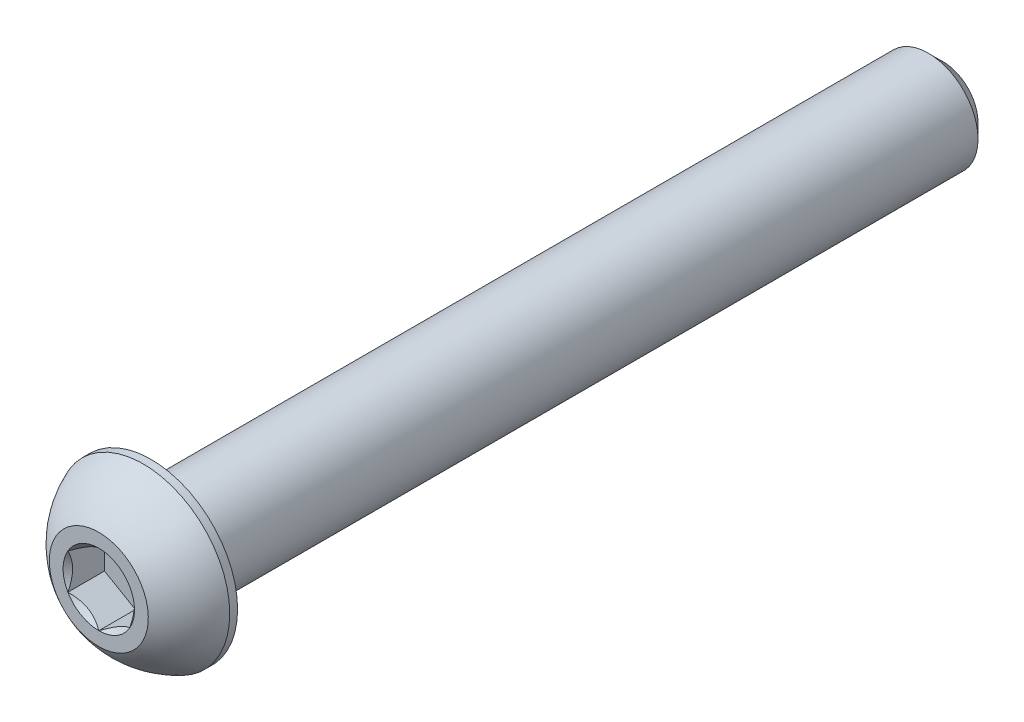
ISO-10303-21;
HEADER;
FILE_DESCRIPTION(('STEP AP214'),'2;1');
FILE_NAME('part.step','',(''),(''),'','','');
FILE_SCHEMA(('AUTOMOTIVE_DESIGN { 1 0 10303 214 1 1 1 1 }'));
ENDSEC;
DATA;
#1=APPLICATION_CONTEXT('core data for automotive mechanical design processes');
#2=APPLICATION_PROTOCOL_DEFINITION('international standard','automotive_design',2000,#1);
#3=PRODUCT_CONTEXT('',#1,'mechanical');
#4=PRODUCT('Part','Part','',(#3));
#5=PRODUCT_RELATED_PRODUCT_CATEGORY('part','',(#4));
#6=PRODUCT_DEFINITION_FORMATION('','',#4);
#7=PRODUCT_DEFINITION_CONTEXT('part definition',#1,'design');
#8=PRODUCT_DEFINITION('design','',#6,#7);
#9=PRODUCT_DEFINITION_SHAPE('','',#8);
#10=(LENGTH_UNIT() NAMED_UNIT(*) SI_UNIT(.MILLI.,.METRE.));
#11=(NAMED_UNIT(*) PLANE_ANGLE_UNIT() SI_UNIT($,.RADIAN.));
#12=(NAMED_UNIT(*) SI_UNIT($,.STERADIAN.) SOLID_ANGLE_UNIT());
#13=UNCERTAINTY_MEASURE_WITH_UNIT(LENGTH_MEASURE(1.E-05),#10,'distance_accuracy_value','');
#14=(GEOMETRIC_REPRESENTATION_CONTEXT(3) GLOBAL_UNCERTAINTY_ASSIGNED_CONTEXT((#13)) GLOBAL_UNIT_ASSIGNED_CONTEXT((#10,
#11,#12)) REPRESENTATION_CONTEXT('',''));
#15=CARTESIAN_POINT('',(0.,0.,0.));
#16=DIRECTION('',(0.,0.,1.));
#17=DIRECTION('',(1.,0.,0.));
#18=AXIS2_PLACEMENT_3D('',#15,#16,#17);
#19=CARTESIAN_POINT('',(0.,-3.175,-54.1528));
#20=DIRECTION('',(0.,0.,-1.));
#21=DIRECTION('',(0.,1.,0.));
#22=AXIS2_PLACEMENT_3D('',#19,#20,#21);
#23=PLANE('',#22);
#24=CARTESIAN_POINT('',(0.,0.,-54.1528));
#25=DIRECTION('',(0.,0.,-1.));
#26=DIRECTION('',(0.,1.,0.));
#27=AXIS2_PLACEMENT_3D('',#24,#25,#26);
#28=CIRCLE('',#27,2.24573170731707);
#29=CARTESIAN_POINT('',(0.,-2.24573170731706,-54.1528));
#30=VERTEX_POINT('',#29);
#31=EDGE_CURVE('E175',#30,#30,#28,.T.);
#32=ORIENTED_EDGE('',*,*,#31,.T.);
#33=EDGE_LOOP('',(#32));
#34=FACE_BOUND('',#33,.T.);
#35=ADVANCED_FACE('F36',(#34),#23,.T.);
#36=CARTESIAN_POINT('',(0.,0.,-54.1528));
#37=DIRECTION('',(0.,0.,-1.));
#38=DIRECTION('',(0.,1.,0.));
#39=AXIS2_PLACEMENT_3D('',#36,#37,#38);
#40=CYLINDRICAL_SURFACE('',#39,3.175);
#41=CARTESIAN_POINT('',(0.,0.,-53.2235317073171));
#42=DIRECTION('',(0.,0.,-1.));
#43=DIRECTION('',(0.,1.,0.));
#44=AXIS2_PLACEMENT_3D('',#41,#42,#43);
#45=CIRCLE('',#44,3.175);
#46=CARTESIAN_POINT('',(0.,-3.17499999999999,-53.2235317073171));
#47=VERTEX_POINT('',#46);
#48=EDGE_CURVE('E49',#47,#47,#45,.F.);
#49=ORIENTED_EDGE('',*,*,#48,.T.);
#50=EDGE_LOOP('',(#49));
#51=FACE_BOUND('',#50,.T.);
#52=CARTESIAN_POINT('',(0.,0.,-3.3528));
#53=DIRECTION('',(0.,0.,1.));
#54=DIRECTION('',(1.,0.,0.));
#55=AXIS2_PLACEMENT_3D('',#52,#53,#54);
#56=CIRCLE('',#55,3.175);
#57=CARTESIAN_POINT('',(3.175,0.,-3.3528));
#58=VERTEX_POINT('',#57);
#59=EDGE_CURVE('E172',#58,#58,#56,.F.);
#60=ORIENTED_EDGE('',*,*,#59,.T.);
#61=EDGE_LOOP('',(#60));
#62=FACE_BOUND('',#61,.T.);
#63=ADVANCED_FACE('F180',(#51,#62),#40,.T.);
#64=CARTESIAN_POINT('',(0.,0.,-54.1528));
#65=DIRECTION('',(0.,0.,1.));
#66=DIRECTION('',(0.,-1.,0.));
#67=AXIS2_PLACEMENT_3D('',#64,#65,#66);
#68=CONICAL_SURFACE('',#67,2.24573170731707,0.785398163397446);
#69=CARTESIAN_POINT('',(0.,-3.17499999999999,-53.2235317073171));
#70=CARTESIAN_POINT('',(0.,-3.16532012195122,-53.2332115853659));
#71=CARTESIAN_POINT('',(0.,-3.15564024390244,-53.2428914634146));
#72=CARTESIAN_POINT('',(0.,-3.13628048780487,-53.2622512195122));
#73=CARTESIAN_POINT('',(0.,-3.12660060975609,-53.271931097561));
#74=CARTESIAN_POINT('',(0.,-3.10724085365853,-53.2912908536585));
#75=CARTESIAN_POINT('',(0.,-3.09756097560975,-53.3009707317073));
#76=CARTESIAN_POINT('',(0.,-3.07820121951219,-53.3203304878049));
#77=CARTESIAN_POINT('',(0.,-3.06852134146341,-53.3300103658537));
#78=CARTESIAN_POINT('',(0.,-3.04916158536585,-53.3493701219512));
#79=CARTESIAN_POINT('',(0.,-3.03948170731707,-53.35905));
#80=CARTESIAN_POINT('',(0.,-3.02012195121951,-53.3784097560976));
#81=CARTESIAN_POINT('',(0.,-3.01044207317073,-53.3880896341463));
#82=CARTESIAN_POINT('',(0.,-2.99108231707316,-53.4074493902439));
#83=CARTESIAN_POINT('',(0.,-2.98140243902438,-53.4171292682927));
#84=CARTESIAN_POINT('',(0.,-2.96204268292682,-53.4364890243902));
#85=CARTESIAN_POINT('',(0.,-2.95236280487804,-53.446168902439));
#86=CARTESIAN_POINT('',(0.,-2.93300304878048,-53.4655286585366));
#87=CARTESIAN_POINT('',(0.,-2.9233231707317,-53.4752085365854));
#88=CARTESIAN_POINT('',(0.,-2.90396341463414,-53.4945682926829));
#89=CARTESIAN_POINT('',(0.,-2.89428353658536,-53.5042481707317));
#90=CARTESIAN_POINT('',(0.,-2.8749237804878,-53.5236079268293));
#91=CARTESIAN_POINT('',(0.,-2.86524390243902,-53.533287804878));
#92=CARTESIAN_POINT('',(0.,-2.84588414634146,-53.5526475609756));
#93=CARTESIAN_POINT('',(0.,-2.83620426829268,-53.5623274390244));
#94=CARTESIAN_POINT('',(0.,-2.81684451219511,-53.581687195122));
#95=CARTESIAN_POINT('',(0.,-2.80716463414633,-53.5913670731707));
#96=CARTESIAN_POINT('',(0.,-2.78780487804877,-53.6107268292683));
#97=CARTESIAN_POINT('',(0.,-2.77812499999999,-53.6204067073171));
#98=CARTESIAN_POINT('',(0.,-2.75876524390243,-53.6397664634146));
#99=CARTESIAN_POINT('',(0.,-2.74908536585365,-53.6494463414634));
#100=CARTESIAN_POINT('',(0.,-2.72972560975609,-53.668806097561));
#101=CARTESIAN_POINT('',(0.,-2.72004573170731,-53.6784859756098));
#102=CARTESIAN_POINT('',(0.,-2.70068597560975,-53.6978457317073));
#103=CARTESIAN_POINT('',(0.,-2.69100609756097,-53.7075256097561));
#104=CARTESIAN_POINT('',(0.,-2.67164634146341,-53.7268853658537));
#105=CARTESIAN_POINT('',(0.,-2.66196646341463,-53.7365652439024));
#106=CARTESIAN_POINT('',(0.,-2.64260670731706,-53.755925));
#107=CARTESIAN_POINT('',(0.,-2.63292682926828,-53.7656048780488));
#108=CARTESIAN_POINT('',(0.,-2.61356707317072,-53.7849646341463));
#109=CARTESIAN_POINT('',(0.,-2.60388719512194,-53.7946445121951));
#110=CARTESIAN_POINT('',(0.,-2.58452743902438,-53.8140042682927));
#111=CARTESIAN_POINT('',(0.,-2.5748475609756,-53.8236841463415));
#112=CARTESIAN_POINT('',(0.,-2.55548780487804,-53.843043902439));
#113=CARTESIAN_POINT('',(0.,-2.54580792682926,-53.8527237804878));
#114=CARTESIAN_POINT('',(0.,-2.5264481707317,-53.8720835365854));
#115=CARTESIAN_POINT('',(0.,-2.51676829268292,-53.8817634146342));
#116=CARTESIAN_POINT('',(0.,-2.49740853658536,-53.9011231707317));
#117=CARTESIAN_POINT('',(0.,-2.48772865853658,-53.9108030487805));
#118=CARTESIAN_POINT('',(0.,-2.46836890243901,-53.9301628048781));
#119=CARTESIAN_POINT('',(0.,-2.45868902439023,-53.9398426829268));
#120=CARTESIAN_POINT('',(0.,-2.43932926829267,-53.9592024390244));
#121=CARTESIAN_POINT('',(0.,-2.42964939024389,-53.9688823170732));
#122=CARTESIAN_POINT('',(0.,-2.41028963414633,-53.9882420731707));
#123=CARTESIAN_POINT('',(0.,-2.40060975609755,-53.9979219512195));
#124=CARTESIAN_POINT('',(0.,-2.38124999999999,-54.0172817073171));
#125=CARTESIAN_POINT('',(0.,-2.37157012195121,-54.0269615853659));
#126=CARTESIAN_POINT('',(0.,-2.35221036585365,-54.0463213414634));
#127=CARTESIAN_POINT('',(0.,-2.34253048780487,-54.0560012195122));
#128=CARTESIAN_POINT('',(0.,-2.32317073170731,-54.0753609756098));
#129=CARTESIAN_POINT('',(0.,-2.31349085365853,-54.0850408536585));
#130=CARTESIAN_POINT('',(0.,-2.29413109756096,-54.1044006097561));
#131=CARTESIAN_POINT('',(0.,-2.28445121951218,-54.1140804878049));
#132=CARTESIAN_POINT('',(0.,-2.26509146341462,-54.1334402439024));
#133=CARTESIAN_POINT('',(0.,-2.25541158536584,-54.1431201219512));
#134=CARTESIAN_POINT('',(0.,-2.24573170731706,-54.1528));
#135=B_SPLINE_CURVE_WITH_KNOTS('',3,(#69,#70,#71,#72,#73,#74,#75,#76,#77,#78,#79,#80,#81,#82,
#83,#84,#85,#86,#87,#88,#89,#90,#91,#92,#93,#94,#95,#96,#97,#98,#99,#100,#101,#102,#103,#104,
#105,#106,#107,#108,#109,#110,#111,#112,#113,#114,#115,#116,#117,#118,#119,#120,#121,#122,#123,
#124,#125,#126,#127,#128,#129,#130,#131,#132,#133,#134),.UNSPECIFIED.,.F.,.F.,(4,2,2,2,2,2,2,2,
2,2,2,2,2,2,2,2,2,2,2,2,2,2,2,2,2,2,2,2,2,2,2,2,4),(0.,0.0410682444561137,0.0821364889122225,
0.123204733368331,0.16427297782444,0.205341222280549,0.246409466736658,0.287477711192767,
0.328545955648876,0.369614200104985,0.410682444561093,0.451750689017207,0.492818933473316,
0.533887177929425,0.574955422385534,0.616023666841642,0.657091911297752,0.69816015575386,
0.739228400209969,0.780296644666078,0.821364889122187,0.862433133578296,0.90350137803441,
0.944569622490518,0.985637866946627,1.02670611140274,1.06777435585885,1.10884260031495,
1.14991084477106,1.19097908922717,1.23204733368328,1.27311557813939,1.3141838225955),.UNSPECIFIED.);
#136=EDGE_CURVE('BSEAM38',#47,#30,#135,.T.);
#137=ORIENTED_EDGE('',*,*,#48,.F.);
#138=ORIENTED_EDGE('',*,*,#31,.F.);
#139=ORIENTED_EDGE('',*,*,#136,.T.);
#140=ORIENTED_EDGE('',*,*,#136,.F.);
#141=EDGE_LOOP('',(#137,#139,#138,#140));
#142=FACE_BOUND('',#141,.T.);
#143=ADVANCED_FACE('F38',(#142),#68,.T.);
#144=CARTESIAN_POINT('',(0.,0.,-5.060315));
#145=DIRECTION('',(0.,0.,1.));
#146=DIRECTION('',(0.,-1.,0.));
#147=AXIS2_PLACEMENT_3D('',#144,#145,#146);
#148=SPHERICAL_SURFACE('',#147,5.97389428256184);
#149=CARTESIAN_POINT('',(0.,0.,0.));
#150=DIRECTION('',(0.,0.,1.));
#151=DIRECTION('',(1.,0.,0.));
#152=AXIS2_PLACEMENT_3D('',#149,#150,#151);
#153=CIRCLE('',#152,3.175);
#154=CARTESIAN_POINT('',(0.,-3.175,0.));
#155=VERTEX_POINT('',#154);
#156=EDGE_CURVE('E169',#155,#155,#153,.T.);
#157=CARTESIAN_POINT('',(0.,0.,-2.84988));
#158=DIRECTION('',(0.,0.,1.));
#159=DIRECTION('',(1.,0.,0.));
#160=AXIS2_PLACEMENT_3D('',#157,#158,#159);
#161=CIRCLE('',#160,5.5499);
#162=CARTESIAN_POINT('',(0.,-5.5499,-2.84988));
#163=VERTEX_POINT('',#162);
#164=EDGE_CURVE('E163',#163,#163,#161,.T.);
#165=CARTESIAN_POINT('',(0.,-3.175,0.));
#166=CARTESIAN_POINT('',(0.,-3.20828343957184,-0.020883007658051));
#167=CARTESIAN_POINT('',(0.,-3.24136078860705,-0.0420944789280512));
#168=CARTESIAN_POINT('',(0.,-3.30709055775141,-0.0851658910984726));
#169=CARTESIAN_POINT('',(0.,-3.33974297786056,-0.107025831998894));
#170=CARTESIAN_POINT('',(0.,-3.40461014130008,-0.151385725836677));
#171=CARTESIAN_POINT('',(0.,-3.43682488463043,-0.173885678774039));
#172=CARTESIAN_POINT('',(0.,-3.50080416139461,-0.21951682225948));
#173=CARTESIAN_POINT('',(0.,-3.53256869482844,-0.242648012807558));
#174=CARTESIAN_POINT('',(0.,-3.59563518208834,-0.289532629449103));
#175=CARTESIAN_POINT('',(0.,-3.62693713591442,-0.313286055542569));
#176=CARTESIAN_POINT('',(0.,-3.68906627753106,-0.361405894091331));
#177=CARTESIAN_POINT('',(0.,-3.71989346532163,-0.385772306546627));
#178=CARTESIAN_POINT('',(0.,-3.78106107243204,-0.435108631276878));
#179=CARTESIAN_POINT('',(0.,-3.8114014917519,-0.460078543551834));
#180=CARTESIAN_POINT('',(0.,-3.87158374923259,-0.510612146063938));
#181=CARTESIAN_POINT('',(0.,-3.90142558739343,-0.536175836301087));
#182=CARTESIAN_POINT('',(0.,-3.96059906392414,-0.587887041792084));
#183=CARTESIAN_POINT('',(0.,-3.989930702294,-0.614034557045932));
#184=CARTESIAN_POINT('',(0.,-4.04807235926832,-0.666903232293408));
#185=CARTESIAN_POINT('',(0.,-4.07688237787279,-0.693624392287035));
#186=CARTESIAN_POINT('',(0.,-4.13396957842491,-0.747629953401058));
#187=CARTESIAN_POINT('',(0.,-4.16224676037256,-0.774914354521453));
#188=CARTESIAN_POINT('',(0.,-4.21825727817542,-0.830035774981947));
#189=CARTESIAN_POINT('',(0.,-4.24599061403061,-0.857872794322044));
#190=CARTESIAN_POINT('',(0.,-4.30090264195357,-0.914088613159021));
#191=CARTESIAN_POINT('',(0.,-4.32808133402134,-0.942467412655899));
#192=CARTESIAN_POINT('',(0.,-4.38187349261953,-0.999755742806741));
#193=CARTESIAN_POINT('',(0.,-4.40848695914995,-1.0286652734607));
#194=CARTESIAN_POINT('',(0.,-4.46113830498838,-1.08700381029123));
#195=CARTESIAN_POINT('',(0.,-4.48717618429639,-1.11643281646778));
#196=CARTESIAN_POINT('',(0.,-4.53866621810402,-1.17579884645643));
#197=CARTESIAN_POINT('',(0.,-4.56411837260364,-1.20573587026853));
#198=CARTESIAN_POINT('',(0.,-4.61442704725457,-1.26610627984964));
#199=CARTESIAN_POINT('',(0.,-4.63928356740587,-1.29653966561866));
#200=CARTESIAN_POINT('',(0.,-4.68839129572448,-1.3578909501815));
#201=CARTESIAN_POINT('',(0.,-4.71264250389178,-1.38880884897531));
#202=CARTESIAN_POINT('',(0.,-4.76053016627881,-1.45111712201534));
#203=CARTESIAN_POINT('',(0.,-4.78416662049853,-1.48250749626155));
#204=CARTESIAN_POINT('',(0.,-4.8308155723751,-1.54574849868041));
#205=CARTESIAN_POINT('',(0.,-4.85382807003194,-1.57759912685306));
#206=CARTESIAN_POINT('',(0.,-4.89922014909859,-1.64174823640362));
#207=CARTESIAN_POINT('',(0.,-4.92159973050841,-1.67404671778154));
#208=CARTESIAN_POINT('',(0.,-4.96571726381658,-1.73907895865427));
#209=CARTESIAN_POINT('',(0.,-4.98745521571493,-1.77181271814908));
#210=CARTESIAN_POINT('',(0.,-5.03028102654719,-1.83770277069632));
#211=CARTESIAN_POINT('',(0.,-5.0513688854811,-1.87085906374874));
#212=CARTESIAN_POINT('',(0.,-5.09288630004063,-1.93758127434189));
#213=CARTESIAN_POINT('',(0.,-5.11331585566624,-1.97114719188261));
#214=CARTESIAN_POINT('',(0.,-5.15350870956168,-2.03867558290299));
#215=CARTESIAN_POINT('',(0.,-5.17327200783151,-2.07263805638265));
#216=CARTESIAN_POINT('',(0.,-5.21212465239608,-2.14094633632486));
#217=CARTESIAN_POINT('',(0.,-5.23121399869082,-2.17529214278741));
#218=CARTESIAN_POINT('',(0.,-5.26871130697935,-2.2443537165359));
#219=CARTESIAN_POINT('',(0.,-5.28711926897315,-2.27906948382184));
#220=CARTESIAN_POINT('',(0.,-5.32324664200827,-2.3488574628552));
#221=CARTESIAN_POINT('',(0.,-5.3409660530496,-2.38392967460262));
#222=CARTESIAN_POINT('',(0.,-5.37570942417474,-2.45441688802313));
#223=CARTESIAN_POINT('',(0.,-5.39273338425856,-2.48983188969622));
#224=CARTESIAN_POINT('',(0.,-5.42607922958184,-2.56099089271574));
#225=CARTESIAN_POINT('',(0.,-5.44240111482132,-2.59673489406217));
#226=CARTESIAN_POINT('',(0.,-5.47433643994316,-2.66853798649801));
#227=CARTESIAN_POINT('',(0.,-5.48994987982553,-2.70459707758742));
#228=CARTESIAN_POINT('',(0.,-5.52046229408188,-2.77701628549785));
#229=CARTESIAN_POINT('',(0.,-5.53536126845586,-2.81337640231887));
#230=CARTESIAN_POINT('',(0.,-5.5499,-2.84988));
#231=B_SPLINE_CURVE_WITH_KNOTS('',3,(#165,#166,#167,#168,#169,#170,#171,#172,#173,#174,#175,
#176,#177,#178,#179,#180,#181,#182,#183,#184,#185,#186,#187,#188,#189,#190,#191,#192,#193,#194,
#195,#196,#197,#198,#199,#200,#201,#202,#203,#204,#205,#206,#207,#208,#209,#210,#211,#212,#213,
#214,#215,#216,#217,#218,#219,#220,#221,#222,#223,#224,#225,#226,#227,#228,#229,#230),
.UNSPECIFIED.,.F.,.F.,(4,2,2,2,2,2,2,2,2,2,2,2,2,2,2,2,2,2,2,2,2,2,2,2,2,2,2,2,2,2,2,2,4),(0.,
0.1178750807537,0.235750161507399,0.353625242261099,0.471500323014798,0.589375403768498,
0.707250484522197,0.825125565275897,0.943000646029597,1.0608757267833,1.17875080753699,
1.29662588829069,1.41450096904439,1.53237604979809,1.65025113055179,1.76812621130549,
1.88600129205919,2.00387637281289,2.12175145356659,2.23962653432029,2.35750161507399,
2.47537669582769,2.59325177658139,2.71112685733509,2.82900193808879,2.94687701884249,
3.06475209959619,3.18262718034989,3.30050226110359,3.41837734185729,3.53625242261099,
3.65412750336468,3.77200258411838),.UNSPECIFIED.);
#232=EDGE_CURVE('BSEAM185',#155,#163,#231,.T.);
#233=ORIENTED_EDGE('',*,*,#156,.F.);
#234=ORIENTED_EDGE('',*,*,#164,.T.);
#235=ORIENTED_EDGE('',*,*,#232,.T.);
#236=ORIENTED_EDGE('',*,*,#232,.F.);
#237=EDGE_LOOP('',(#233,#235,#234,#236));
#238=FACE_BOUND('',#237,.T.);
#239=ADVANCED_FACE('F185',(#238),#148,.T.);
#240=CARTESIAN_POINT('',(0.,-3.175,0.));
#241=DIRECTION('',(0.,0.,-1.));
#242=DIRECTION('',(-1.,0.,0.));
#243=AXIS2_PLACEMENT_3D('',#240,#241,#242);
#244=PLANE('',#243);
#245=CARTESIAN_POINT('',(0.,0.,0.));
#246=DIRECTION('',(0.,0.,1.));
#247=DIRECTION('',(1.,0.,0.));
#248=AXIS2_PLACEMENT_3D('',#245,#246,#247);
#249=CIRCLE('',#248,2.29135888084633);
#250=CARTESIAN_POINT('',(-1.984375,1.14567944042316,0.));
#251=VERTEX_POINT('',#250);
#252=CARTESIAN_POINT('',(-1.984375,-1.14567944042316,0.));
#253=VERTEX_POINT('',#252);
#254=EDGE_CURVE('E62',#251,#253,#249,.T.);
#255=ORIENTED_EDGE('',*,*,#254,.F.);
#256=CARTESIAN_POINT('',(0.,2.29135888084633,0.));
#257=VERTEX_POINT('',#256);
#258=EDGE_CURVE('E134',#257,#251,#249,.T.);
#259=ORIENTED_EDGE('',*,*,#258,.F.);
#260=CARTESIAN_POINT('',(1.984375,1.14567944042316,0.));
#261=VERTEX_POINT('',#260);
#262=EDGE_CURVE('E131',#261,#257,#249,.T.);
#263=ORIENTED_EDGE('',*,*,#262,.F.);
#264=CARTESIAN_POINT('',(1.984375,-1.14567944042316,0.));
#265=VERTEX_POINT('',#264);
#266=EDGE_CURVE('E102',#265,#261,#249,.T.);
#267=ORIENTED_EDGE('',*,*,#266,.F.);
#268=CARTESIAN_POINT('',(0.,-2.29135888084633,0.));
#269=VERTEX_POINT('',#268);
#270=EDGE_CURVE('E94',#269,#265,#249,.T.);
#271=ORIENTED_EDGE('',*,*,#270,.F.);
#272=EDGE_CURVE('E55',#253,#269,#249,.T.);
#273=ORIENTED_EDGE('',*,*,#272,.F.);
#274=EDGE_LOOP('',(#255,#259,#263,#267,#271,#273));
#275=FACE_BOUND('',#274,.T.);
#276=ORIENTED_EDGE('',*,*,#156,.T.);
#277=EDGE_LOOP('',(#276));
#278=FACE_BOUND('',#277,.T.);
#279=ADVANCED_FACE('F128',(#275,#278),#244,.F.);
#280=CARTESIAN_POINT('',(0.,-5.5499,-3.3528));
#281=DIRECTION('',(0.,0.,1.));
#282=DIRECTION('',(1.,0.,0.));
#283=AXIS2_PLACEMENT_3D('',#280,#281,#282);
#284=PLANE('',#283);
#285=ORIENTED_EDGE('',*,*,#59,.F.);
#286=EDGE_LOOP('',(#285));
#287=FACE_BOUND('',#286,.T.);
#288=CARTESIAN_POINT('',(0.,0.,-3.3528));
#289=DIRECTION('',(0.,0.,1.));
#290=DIRECTION('',(1.,0.,0.));
#291=AXIS2_PLACEMENT_3D('',#288,#289,#290);
#292=CIRCLE('',#291,5.5499);
#293=CARTESIAN_POINT('',(5.5499,0.,-3.3528));
#294=VERTEX_POINT('',#293);
#295=EDGE_CURVE('E166',#294,#294,#292,.T.);
#296=ORIENTED_EDGE('',*,*,#295,.F.);
#297=EDGE_LOOP('',(#296));
#298=FACE_BOUND('',#297,.T.);
#299=ADVANCED_FACE('F199',(#287,#298),#284,.F.);
#300=CARTESIAN_POINT('',(0.,0.,0.));
#301=DIRECTION('',(0.,0.,1.));
#302=DIRECTION('',(1.,0.,0.));
#303=AXIS2_PLACEMENT_3D('',#300,#301,#302);
#304=CYLINDRICAL_SURFACE('',#303,5.5499);
#305=ORIENTED_EDGE('',*,*,#164,.F.);
#306=EDGE_LOOP('',(#305));
#307=FACE_BOUND('',#306,.T.);
#308=ORIENTED_EDGE('',*,*,#295,.T.);
#309=EDGE_LOOP('',(#308));
#310=FACE_BOUND('',#309,.T.);
#311=ADVANCED_FACE('F202',(#307,#310),#304,.T.);
#312=CARTESIAN_POINT('',(0.,0.,0.));
#313=DIRECTION('',(0.,0.,1.));
#314=DIRECTION('',(1.,0.,0.));
#315=AXIS2_PLACEMENT_3D('',#312,#313,#314);
#316=CONICAL_SURFACE('',#315,2.29135888084633,0.78539816339745);
#317=ORIENTED_EDGE('',*,*,#266,.T.);
#318=CARTESIAN_POINT('',(1.984375,-2.28495242157822,0.734984078816568));
#319=CARTESIAN_POINT('',(1.984375,-2.22931635455402,0.692986685550761));
#320=CARTESIAN_POINT('',(1.984375,-2.17336876548389,0.651396054076336));
#321=CARTESIAN_POINT('',(1.984375,-2.06072770258171,0.569208461471479));
#322=CARTESIAN_POINT('',(1.984375,-2.00403404503435,0.528611752405042));
#323=CARTESIAN_POINT('',(1.984375,-1.88936329173488,0.448303503174669));
#324=CARTESIAN_POINT('',(1.984375,-1.83137965519348,0.408601258813307));
#325=CARTESIAN_POINT('',(1.984375,-1.7144280213784,0.330685173401292));
#326=CARTESIAN_POINT('',(1.984375,-1.65546009407228,0.292471227194368));
#327=CARTESIAN_POINT('',(1.984375,-1.47005472306035,0.176252834013636));
#328=CARTESIAN_POINT('',(1.984375,-1.34163909427883,0.101347886872381));
#329=CARTESIAN_POINT('',(1.984375,-1.0784038470548,-0.0356697845602626));
#330=CARTESIAN_POINT('',(1.984375,-0.943607781407425,-0.0978256335176257));
#331=CARTESIAN_POINT('',(1.984375,-0.741275100444882,-0.173867421311381));
#332=CARTESIAN_POINT('',(1.984375,-0.676735408881095,-0.195691938673995));
#333=CARTESIAN_POINT('',(1.984375,-0.546098118112762,-0.234159536462205));
#334=CARTESIAN_POINT('',(1.984375,-0.480000411919956,-0.250802259934452));
#335=CARTESIAN_POINT('',(1.984375,-0.347746170028532,-0.277764619130277));
#336=CARTESIAN_POINT('',(1.984375,-0.281612071479123,-0.288192590264108));
#337=CARTESIAN_POINT('',(1.984375,-0.14863662005235,-0.302521852623404));
#338=CARTESIAN_POINT('',(1.984375,-0.0817953907393235,-0.306424265772614));
#339=CARTESIAN_POINT('',(1.984375,0.0495156750890646,-0.307412948667328));
#340=CARTESIAN_POINT('',(1.984375,0.113983775102992,-0.304740821124985));
#341=CARTESIAN_POINT('',(1.984375,0.242367515846177,-0.293260789502485));
#342=CARTESIAN_POINT('',(1.984375,0.30628310229592,-0.284452289360786));
#343=CARTESIAN_POINT('',(1.984375,0.434181040262184,-0.261030978667103));
#344=CARTESIAN_POINT('',(1.984375,0.498145026858309,-0.246319393767914));
#345=CARTESIAN_POINT('',(1.984375,0.624675616953007,-0.211873818587874));
#346=CARTESIAN_POINT('',(1.984375,0.687242336899689,-0.192140248550805));
#347=CARTESIAN_POINT('',(1.984375,0.884225483826087,-0.12258776276924));
#348=CARTESIAN_POINT('',(1.984375,1.01583674256468,-0.0648475887435035));
#349=CARTESIAN_POINT('',(1.984375,1.27288659242652,0.0635303365887973));
#350=CARTESIAN_POINT('',(1.984375,1.3983008827048,0.134214424919412));
#351=CARTESIAN_POINT('',(1.984375,1.57956687990221,0.244516663813198));
#352=CARTESIAN_POINT('',(1.984375,1.63738271299424,0.280969829475363));
#353=CARTESIAN_POINT('',(1.984375,1.75202215386201,0.355415963291704));
#354=CARTESIAN_POINT('',(1.984375,1.80884568601361,0.393409048078053));
#355=CARTESIAN_POINT('',(1.984375,1.92116923084255,0.470338808893089));
#356=CARTESIAN_POINT('',(1.984375,1.97667624512253,0.50926531303879));
#357=CARTESIAN_POINT('',(1.984375,2.08693170717166,0.588147746121385));
#358=CARTESIAN_POINT('',(1.984375,2.14168035934792,0.628103389024029));
#359=CARTESIAN_POINT('',(1.984375,2.19611149046622,0.668480611285425));
#360=B_SPLINE_CURVE_WITH_KNOTS('',3,(#318,#319,#320,#321,#322,#323,#324,#325,#326,#327,#328,
#329,#330,#331,#332,#333,#334,#335,#336,#337,#338,#339,#340,#341,#342,#343,#344,#345,#346,#347,
#348,#349,#350,#351,#352,#353,#354,#355,#356,#357,#358,#359),.UNSPECIFIED.,.F.,.F.,(4,2,2,2,2,2,
2,2,2,2,2,2,2,2,2,2,2,2,2,2,4),(0.,0.209126070008322,0.418304637356569,0.629103979977992,
0.839888401371185,1.28549951116127,1.72957750768351,1.93379389749971,2.13802435186698,
2.33858179514334,2.53910475350639,2.73236963400794,2.92565329006887,3.12231577097487,
3.31896180041345,3.74886295245172,4.18033428125362,4.3853601718029,4.59040161996382,
4.79377749165107,4.99709743524131),.UNSPECIFIED.);
#361=EDGE_CURVE('E11',#265,#261,#360,.T.);
#362=ORIENTED_EDGE('',*,*,#361,.F.);
#363=EDGE_LOOP('',(#317,#362));
#364=FACE_BOUND('',#363,.T.);
#365=ADVANCED_FACE('F106',(#364),#316,.F.);
#366=ORIENTED_EDGE('',*,*,#262,.T.);
#367=CARTESIAN_POINT('',(1.984575,1.14556397036933,0.000115478781843379));
#368=CARTESIAN_POINT('',(1.9163590048332,1.18494849354192,-0.0392371477360852));
#369=CARTESIAN_POINT('',(1.84700231489303,1.22499159714897,-0.0762786895538154));
#370=CARTESIAN_POINT('',(1.70557619954781,1.30664400291398,-0.144101141576677));
#371=CARTESIAN_POINT('',(1.63349332126322,1.34826107209555,-0.174844310908246));
#372=CARTESIAN_POINT('',(1.488141602734,1.43217992591557,-0.227508111188786));
#373=CARTESIAN_POINT('',(1.41490978751306,1.47446033414663,-0.249561124120036));
#374=CARTESIAN_POINT('',(1.26683381740529,1.55995203534886,-0.283538507056124));
#375=CARTESIAN_POINT('',(1.19199418724658,1.60316071596705,-0.295488243908272));
#376=CARTESIAN_POINT('',(1.06301458545618,1.6776271237807,-0.306269900918094));
#377=CARTESIAN_POINT('',(1.00904128422756,1.7087886237741,-0.30786610094093));
#378=CARTESIAN_POINT('',(0.901182881480199,1.77106070163465,-0.305178161134708));
#379=CARTESIAN_POINT('',(0.847297817514476,1.80217125782056,-0.300891959659541));
#380=CARTESIAN_POINT('',(0.740036461751395,1.86409863044402,-0.286683126986481));
#381=CARTESIAN_POINT('',(0.686660807239859,1.89491507894443,-0.276754189547727));
#382=CARTESIAN_POINT('',(0.580832482591103,1.95601509066828,-0.251804915725461));
#383=CARTESIAN_POINT('',(0.528379742028898,1.9862986945516,-0.236784969610512));
#384=CARTESIAN_POINT('',(0.394017661036351,2.06387267818152,-0.19219214836433));
#385=CARTESIAN_POINT('',(0.312941642841675,2.11068193911104,-0.159257004061667));
#386=CARTESIAN_POINT('',(0.19372669327016,2.17951072233758,-0.103657558797803));
#387=CARTESIAN_POINT('',(0.154440075613999,2.20219286161692,-0.0841224079481377));
#388=CARTESIAN_POINT('',(0.0765946381319469,2.24713694590237,-0.0432712618805986));
#389=CARTESIAN_POINT('',(0.0380353888983011,2.26939913882716,-0.0219563604316497));
#390=CARTESIAN_POINT('',(-0.000200000000000015,2.29147435090017,0.000115478781842912));
#391=B_SPLINE_CURVE_WITH_KNOTS('',3,(#367,#368,#369,#370,#371,#372,#373,#374,#375,#376,#377,
#378,#379,#380,#381,#382,#383,#384,#385,#386,#387,#388,#389,#390),.UNSPECIFIED.,.F.,.F.,(4,2,2,
2,2,2,2,2,2,2,2,4),(0.,0.264339630306627,0.530219665093694,0.791876416371461,1.05287424418109,
1.239639843932,1.42647091743852,1.61351120244035,1.8005371524754,2.09764209964316,
2.24579179873714,2.39385111134157),.UNSPECIFIED.);
#392=EDGE_CURVE('E133',#261,#257,#391,.T.);
#393=ORIENTED_EDGE('',*,*,#392,.F.);
#394=EDGE_LOOP('',(#366,#393));
#395=FACE_BOUND('',#394,.T.);
#396=ADVANCED_FACE('F282',(#395),#316,.F.);
#397=ORIENTED_EDGE('',*,*,#258,.T.);
#398=CARTESIAN_POINT('',(0.000199999999999816,2.29147435090017,0.000115478781843248));
#399=CARTESIAN_POINT('',(-0.0680159951668024,2.25208982772757,-0.0392371477360855));
#400=CARTESIAN_POINT('',(-0.137372685106966,2.21204672412052,-0.0762786895538156));
#401=CARTESIAN_POINT('',(-0.278798800452188,2.13039431835551,-0.144101141576677));
#402=CARTESIAN_POINT('',(-0.350881678736783,2.08877724917394,-0.174844310908247));
#403=CARTESIAN_POINT('',(-0.496233397266004,2.00485839535392,-0.227508111188787));
#404=CARTESIAN_POINT('',(-0.569465212486939,1.96257798712287,-0.249561124120037));
#405=CARTESIAN_POINT('',(-0.717541182594707,1.87708628592063,-0.283538507056125));
#406=CARTESIAN_POINT('',(-0.792380812753425,1.83387760530244,-0.295488243908272));
#407=CARTESIAN_POINT('',(-0.921360414543816,1.75941119748879,-0.306269900918094));
#408=CARTESIAN_POINT('',(-0.975333715772443,1.72824969749539,-0.307866100940931));
#409=CARTESIAN_POINT('',(-1.0831921185198,1.66597761963484,-0.305178161134708));
#410=CARTESIAN_POINT('',(-1.13707718248552,1.63486706344893,-0.300891959659542));
#411=CARTESIAN_POINT('',(-1.2443385382486,1.57293969082547,-0.286683126986482));
#412=CARTESIAN_POINT('',(-1.29771419276014,1.54212324232506,-0.276754189547728));
#413=CARTESIAN_POINT('',(-1.4035425174089,1.48102323060122,-0.251804915725462));
#414=CARTESIAN_POINT('',(-1.4559952579711,1.45073962671789,-0.236784969610513));
#415=CARTESIAN_POINT('',(-1.59035733896365,1.37316564308797,-0.192192148364331));
#416=CARTESIAN_POINT('',(-1.67143335715832,1.32635638215845,-0.159257004061668));
#417=CARTESIAN_POINT('',(-1.79064830672984,1.25752759893191,-0.103657558797804));
#418=CARTESIAN_POINT('',(-1.829934924386,1.23484545965257,-0.0841224079481383));
#419=CARTESIAN_POINT('',(-1.90778036186805,1.18990137536712,-0.0432712618805989));
#420=CARTESIAN_POINT('',(-1.9463396111017,1.16763918244233,-0.0219563604316499));
#421=CARTESIAN_POINT('',(-1.984575,1.14556397036932,0.000115478781842648));
#422=B_SPLINE_CURVE_WITH_KNOTS('',3,(#398,#399,#400,#401,#402,#403,#404,#405,#406,#407,#408,
#409,#410,#411,#412,#413,#414,#415,#416,#417,#418,#419,#420,#421),.UNSPECIFIED.,.F.,.F.,(4,2,2,
2,2,2,2,2,2,2,2,4),(0.,0.264339630306627,0.530219665093695,0.791876416371461,1.05287424418109,
1.239639843932,1.42647091743852,1.61351120244035,1.8005371524754,2.09764209964316,
2.24579179873714,2.39385111134157),.UNSPECIFIED.);
#423=EDGE_CURVE('E138',#257,#251,#422,.T.);
#424=ORIENTED_EDGE('',*,*,#423,.F.);
#425=EDGE_LOOP('',(#397,#424));
#426=FACE_BOUND('',#425,.T.);
#427=ADVANCED_FACE('F141',(#426),#316,.F.);
#428=ORIENTED_EDGE('',*,*,#254,.T.);
#429=CARTESIAN_POINT('',(-1.984375,-2.28495242157822,0.734984078816568));
#430=CARTESIAN_POINT('',(-1.984375,-2.22931635455402,0.692986685550762));
#431=CARTESIAN_POINT('',(-1.984375,-2.17336876548389,0.651396054076336));
#432=CARTESIAN_POINT('',(-1.984375,-2.06072770258171,0.569208461471479));
#433=CARTESIAN_POINT('',(-1.984375,-2.00403404503435,0.528611752405042));
#434=CARTESIAN_POINT('',(-1.984375,-1.88936329173488,0.448303503174668));
#435=CARTESIAN_POINT('',(-1.984375,-1.83137965519348,0.408601258813307));
#436=CARTESIAN_POINT('',(-1.984375,-1.7144280213784,0.330685173401291));
#437=CARTESIAN_POINT('',(-1.984375,-1.65546009407228,0.292471227194368));
#438=CARTESIAN_POINT('',(-1.984375,-1.47005472306035,0.176252834013636));
#439=CARTESIAN_POINT('',(-1.984375,-1.34163909427883,0.101347886872381));
#440=CARTESIAN_POINT('',(-1.984375,-1.0784038470548,-0.0356697845602626));
#441=CARTESIAN_POINT('',(-1.984375,-0.943607781407424,-0.0978256335176254));
#442=CARTESIAN_POINT('',(-1.984375,-0.741275100444882,-0.173867421311382));
#443=CARTESIAN_POINT('',(-1.984375,-0.676735408881095,-0.195691938673995));
#444=CARTESIAN_POINT('',(-1.984375,-0.546098118112762,-0.234159536462205));
#445=CARTESIAN_POINT('',(-1.984375,-0.480000411919956,-0.250802259934452));
#446=CARTESIAN_POINT('',(-1.984375,-0.347746170028531,-0.277764619130277));
#447=CARTESIAN_POINT('',(-1.984375,-0.281612071479122,-0.288192590264109));
#448=CARTESIAN_POINT('',(-1.984375,-0.14863662005235,-0.302521852623404));
#449=CARTESIAN_POINT('',(-1.984375,-0.0817953907393235,-0.306424265772614));
#450=CARTESIAN_POINT('',(-1.984375,0.0495156750890646,-0.307412948667327));
#451=CARTESIAN_POINT('',(-1.984375,0.113983775102992,-0.304740821124985));
#452=CARTESIAN_POINT('',(-1.984375,0.242367515846177,-0.293260789502485));
#453=CARTESIAN_POINT('',(-1.984375,0.30628310229592,-0.284452289360786));
#454=CARTESIAN_POINT('',(-1.984375,0.434181040262185,-0.261030978667103));
#455=CARTESIAN_POINT('',(-1.984375,0.49814502685831,-0.246319393767914));
#456=CARTESIAN_POINT('',(-1.984375,0.624675616953008,-0.211873818587874));
#457=CARTESIAN_POINT('',(-1.984375,0.687242336899689,-0.192140248550805));
#458=CARTESIAN_POINT('',(-1.984375,0.884225483826087,-0.12258776276924));
#459=CARTESIAN_POINT('',(-1.984375,1.01583674256468,-0.0648475887435035));
#460=CARTESIAN_POINT('',(-1.984375,1.27288659242652,0.0635303365887974));
#461=CARTESIAN_POINT('',(-1.984375,1.3983008827048,0.134214424919412));
#462=CARTESIAN_POINT('',(-1.984375,1.57956687990221,0.244516663813198));
#463=CARTESIAN_POINT('',(-1.984375,1.63738271299424,0.280969829475363));
#464=CARTESIAN_POINT('',(-1.984375,1.75202215386202,0.355415963291704));
#465=CARTESIAN_POINT('',(-1.984375,1.80884568601361,0.393409048078053));
#466=CARTESIAN_POINT('',(-1.984375,1.92116923084255,0.47033880889309));
#467=CARTESIAN_POINT('',(-1.984375,1.97667624512253,0.50926531303879));
#468=CARTESIAN_POINT('',(-1.984375,2.08693170717166,0.588147746121386));
#469=CARTESIAN_POINT('',(-1.984375,2.14168035934793,0.628103389024029));
#470=CARTESIAN_POINT('',(-1.984375,2.19611149046622,0.668480611285426));
#471=B_SPLINE_CURVE_WITH_KNOTS('',3,(#429,#430,#431,#432,#433,#434,#435,#436,#437,#438,#439,
#440,#441,#442,#443,#444,#445,#446,#447,#448,#449,#450,#451,#452,#453,#454,#455,#456,#457,#458,
#459,#460,#461,#462,#463,#464,#465,#466,#467,#468,#469,#470),.UNSPECIFIED.,.F.,.F.,(4,2,2,2,2,2,
2,2,2,2,2,2,2,2,2,2,2,2,2,2,4),(0.,0.209126070008322,0.418304637356569,0.629103979977993,
0.839888401371185,1.28549951116127,1.72957750768351,1.93379389749971,2.13802435186698,
2.33858179514334,2.53910475350639,2.73236963400794,2.92565329006887,3.12231577097487,
3.31896180041345,3.74886295245172,4.18033428125362,4.3853601718029,4.59040161996382,
4.79377749165107,4.99709743524131),.UNSPECIFIED.);
#472=EDGE_CURVE('E145',#251,#253,#471,.F.);
#473=ORIENTED_EDGE('',*,*,#472,.F.);
#474=EDGE_LOOP('',(#428,#473));
#475=FACE_BOUND('',#474,.T.);
#476=ADVANCED_FACE('F276',(#475),#316,.F.);
#477=ORIENTED_EDGE('',*,*,#272,.T.);
#478=CARTESIAN_POINT('',(-1.984575,-1.14556397036933,0.000115478781842946));
#479=CARTESIAN_POINT('',(-1.9163590048332,-1.18494849354192,-0.0392371477360852));
#480=CARTESIAN_POINT('',(-1.84700231489303,-1.22499159714897,-0.0762786895538153));
#481=CARTESIAN_POINT('',(-1.70557619954781,-1.30664400291398,-0.144101141576677));
#482=CARTESIAN_POINT('',(-1.63349332126322,-1.34826107209555,-0.174844310908247));
#483=CARTESIAN_POINT('',(-1.488141602734,-1.43217992591557,-0.227508111188787));
#484=CARTESIAN_POINT('',(-1.41490978751306,-1.47446033414662,-0.249561124120037));
#485=CARTESIAN_POINT('',(-1.26683381740529,-1.55995203534886,-0.283538507056125));
#486=CARTESIAN_POINT('',(-1.19199418724658,-1.60316071596705,-0.295488243908272));
#487=CARTESIAN_POINT('',(-1.06301458545618,-1.6776271237807,-0.306269900918094));
#488=CARTESIAN_POINT('',(-1.00904128422756,-1.7087886237741,-0.307866100940931));
#489=CARTESIAN_POINT('',(-0.901182881480199,-1.77106070163465,-0.305178161134708));
#490=CARTESIAN_POINT('',(-0.847297817514476,-1.80217125782056,-0.300891959659541));
#491=CARTESIAN_POINT('',(-0.740036461751395,-1.86409863044402,-0.286683126986481));
#492=CARTESIAN_POINT('',(-0.686660807239859,-1.89491507894443,-0.276754189547728));
#493=CARTESIAN_POINT('',(-0.580832482591103,-1.95601509066828,-0.251804915725462));
#494=CARTESIAN_POINT('',(-0.528379742028898,-1.9862986945516,-0.236784969610512));
#495=CARTESIAN_POINT('',(-0.39401766103635,-2.06387267818152,-0.19219214836433));
#496=CARTESIAN_POINT('',(-0.312941642841675,-2.11068193911104,-0.159257004061668));
#497=CARTESIAN_POINT('',(-0.19372669327016,-2.17951072233758,-0.103657558797804));
#498=CARTESIAN_POINT('',(-0.154440075613998,-2.20219286161692,-0.0841224079481377));
#499=CARTESIAN_POINT('',(-0.0765946381319461,-2.24713694590237,-0.0432712618805983));
#500=CARTESIAN_POINT('',(-0.0380353888983002,-2.26939913882716,-0.0219563604316494));
#501=CARTESIAN_POINT('',(0.000200000000001348,-2.29147435090017,0.000115478781842924));
#502=B_SPLINE_CURVE_WITH_KNOTS('',3,(#478,#479,#480,#481,#482,#483,#484,#485,#486,#487,#488,
#489,#490,#491,#492,#493,#494,#495,#496,#497,#498,#499,#500,#501),.UNSPECIFIED.,.F.,.F.,(4,2,2,
2,2,2,2,2,2,2,2,4),(0.,0.264339630306627,0.530219665093694,0.791876416371461,1.05287424418109,
1.239639843932,1.42647091743852,1.61351120244035,1.8005371524754,2.09764209964316,
2.24579179873714,2.39385111134157),.UNSPECIFIED.);
#503=EDGE_CURVE('E118',#253,#269,#502,.T.);
#504=ORIENTED_EDGE('',*,*,#503,.F.);
#505=EDGE_LOOP('',(#477,#504));
#506=FACE_BOUND('',#505,.T.);
#507=ADVANCED_FACE('F227',(#506),#316,.F.);
#508=ORIENTED_EDGE('',*,*,#270,.T.);
#509=CARTESIAN_POINT('',(-0.000199999999998738,-2.29147435090017,0.000115478781843248));
#510=CARTESIAN_POINT('',(0.0680159951668037,-2.25208982772757,-0.039237147736085));
#511=CARTESIAN_POINT('',(0.137372685106967,-2.21204672412052,-0.076278689553815));
#512=CARTESIAN_POINT('',(0.278798800452189,-2.13039431835551,-0.144101141576677));
#513=CARTESIAN_POINT('',(0.350881678736784,-2.08877724917394,-0.174844310908246));
#514=CARTESIAN_POINT('',(0.496233397266005,-2.00485839535392,-0.227508111188786));
#515=CARTESIAN_POINT('',(0.56946521248694,-1.96257798712287,-0.249561124120036));
#516=CARTESIAN_POINT('',(0.717541182594708,-1.87708628592063,-0.283538507056124));
#517=CARTESIAN_POINT('',(0.792380812753426,-1.83387760530244,-0.295488243908271));
#518=CARTESIAN_POINT('',(0.921360414543817,-1.75941119748879,-0.306269900918094));
#519=CARTESIAN_POINT('',(0.975333715772444,-1.72824969749539,-0.30786610094093));
#520=CARTESIAN_POINT('',(1.0831921185198,-1.66597761963484,-0.305178161134707));
#521=CARTESIAN_POINT('',(1.13707718248553,-1.63486706344893,-0.30089195965954));
#522=CARTESIAN_POINT('',(1.24433853824861,-1.57293969082547,-0.286683126986481));
#523=CARTESIAN_POINT('',(1.29771419276014,-1.54212324232506,-0.276754189547727));
#524=CARTESIAN_POINT('',(1.4035425174089,-1.48102323060122,-0.251804915725461));
#525=CARTESIAN_POINT('',(1.4559952579711,-1.45073962671789,-0.236784969610511));
#526=CARTESIAN_POINT('',(1.59035733896365,-1.37316564308797,-0.192192148364329));
#527=CARTESIAN_POINT('',(1.67143335715833,-1.32635638215845,-0.159257004061667));
#528=CARTESIAN_POINT('',(1.79064830672984,-1.25752759893191,-0.103657558797803));
#529=CARTESIAN_POINT('',(1.829934924386,-1.23484545965257,-0.0841224079481373));
#530=CARTESIAN_POINT('',(1.90778036186805,-1.18990137536712,-0.0432712618805982));
#531=CARTESIAN_POINT('',(1.9463396111017,-1.16763918244233,-0.0219563604316493));
#532=CARTESIAN_POINT('',(1.984575,-1.14556397036933,0.000115478781843057));
#533=B_SPLINE_CURVE_WITH_KNOTS('',3,(#509,#510,#511,#512,#513,#514,#515,#516,#517,#518,#519,
#520,#521,#522,#523,#524,#525,#526,#527,#528,#529,#530,#531,#532),.UNSPECIFIED.,.F.,.F.,(4,2,2,
2,2,2,2,2,2,2,2,4),(0.,0.264339630306627,0.530219665093694,0.79187641637146,1.05287424418109,
1.239639843932,1.42647091743852,1.61351120244035,1.8005371524754,2.09764209964316,
2.24579179873714,2.39385111134157),.UNSPECIFIED.);
#534=EDGE_CURVE('E98',#269,#265,#533,.T.);
#535=ORIENTED_EDGE('',*,*,#534,.F.);
#536=EDGE_LOOP('',(#508,#535));
#537=FACE_BOUND('',#536,.T.);
#538=ADVANCED_FACE('F96',(#537),#316,.F.);
#539=CARTESIAN_POINT('',(1.984375,-1.14567944042316,-2.34696));
#540=DIRECTION('',(0.,0.,1.));
#541=DIRECTION('',(1.,0.,0.));
#542=AXIS2_PLACEMENT_3D('',#539,#540,#541);
#543=PLANE('',#542);
#544=DIRECTION('',(0.866025403784438,0.5,0.));
#545=VECTOR('',#544,1.);
#546=CARTESIAN_POINT('',(0.,-2.29135888084633,-2.34696));
#547=LINE('',#546,#545);
#548=CARTESIAN_POINT('',(0.,-2.29135888084633,-2.34696));
#549=VERTEX_POINT('',#548);
#550=CARTESIAN_POINT('',(1.984375,-1.14567944042316,-2.34696));
#551=VERTEX_POINT('',#550);
#552=EDGE_CURVE('E117',#549,#551,#547,.T.);
#553=ORIENTED_EDGE('',*,*,#552,.T.);
#554=DIRECTION('',(0.,1.,0.));
#555=VECTOR('',#554,1.);
#556=CARTESIAN_POINT('',(1.984375,-1.14567944042316,-2.34696));
#557=LINE('',#556,#555);
#558=CARTESIAN_POINT('',(1.984375,1.14567944042316,-2.34696));
#559=VERTEX_POINT('',#558);
#560=EDGE_CURVE('E122',#551,#559,#557,.T.);
#561=ORIENTED_EDGE('',*,*,#560,.T.);
#562=DIRECTION('',(-0.866025403784439,0.5,0.));
#563=VECTOR('',#562,1.);
#564=CARTESIAN_POINT('',(1.984375,1.14567944042316,-2.34696));
#565=LINE('',#564,#563);
#566=CARTESIAN_POINT('',(0.,2.29135888084633,-2.34696));
#567=VERTEX_POINT('',#566);
#568=EDGE_CURVE('E266',#559,#567,#565,.T.);
#569=ORIENTED_EDGE('',*,*,#568,.T.);
#570=DIRECTION('',(-0.866025403784438,-0.5,0.));
#571=VECTOR('',#570,1.);
#572=CARTESIAN_POINT('',(0.,2.29135888084633,-2.34696));
#573=LINE('',#572,#571);
#574=CARTESIAN_POINT('',(-1.984375,1.14567944042316,-2.34696));
#575=VERTEX_POINT('',#574);
#576=EDGE_CURVE('E154',#567,#575,#573,.T.);
#577=ORIENTED_EDGE('',*,*,#576,.T.);
#578=DIRECTION('',(0.,-1.,0.));
#579=VECTOR('',#578,1.);
#580=CARTESIAN_POINT('',(-1.984375,1.14567944042316,-2.34696));
#581=LINE('',#580,#579);
#582=CARTESIAN_POINT('',(-1.984375,-1.14567944042316,-2.34696));
#583=VERTEX_POINT('',#582);
#584=EDGE_CURVE('E270',#575,#583,#581,.T.);
#585=ORIENTED_EDGE('',*,*,#584,.T.);
#586=DIRECTION('',(0.866025403784439,-0.5,0.));
#587=VECTOR('',#586,1.);
#588=CARTESIAN_POINT('',(-1.984375,-1.14567944042316,-2.34696));
#589=LINE('',#588,#587);
#590=EDGE_CURVE('E125',#583,#549,#589,.T.);
#591=ORIENTED_EDGE('',*,*,#590,.T.);
#592=EDGE_LOOP('',(#553,#561,#569,#577,#585,#591));
#593=FACE_BOUND('',#592,.T.);
#594=ADVANCED_FACE('F226',(#593),#543,.T.);
#595=CARTESIAN_POINT('',(1.984375,-1.14567944042316,-2.34696));
#596=DIRECTION('',(1.,0.,0.));
#597=DIRECTION('',(0.,0.,-1.));
#598=AXIS2_PLACEMENT_3D('',#595,#596,#597);
#599=PLANE('',#598);
#600=DIRECTION('',(0.,0.,1.));
#601=VECTOR('',#600,1.);
#602=CARTESIAN_POINT('',(1.984375,-1.14567944042316,-2.34696));
#603=LINE('',#602,#601);
#604=EDGE_CURVE('E114',#551,#265,#603,.T.);
#605=ORIENTED_EDGE('',*,*,#604,.T.);
#606=ORIENTED_EDGE('',*,*,#361,.T.);
#607=DIRECTION('',(0.,0.,1.));
#608=VECTOR('',#607,1.);
#609=CARTESIAN_POINT('',(1.984375,1.14567944042316,-2.34696));
#610=LINE('',#609,#608);
#611=EDGE_CURVE('E124',#559,#261,#610,.T.);
#612=ORIENTED_EDGE('',*,*,#611,.F.);
#613=ORIENTED_EDGE('',*,*,#560,.F.);
#614=EDGE_LOOP('',(#605,#606,#612,#613));
#615=FACE_BOUND('',#614,.T.);
#616=ADVANCED_FACE('F120',(#615),#599,.F.);
#617=CARTESIAN_POINT('',(1.984375,1.14567944042316,-2.34696));
#618=DIRECTION('',(0.5,0.866025403784439,0.));
#619=DIRECTION('',(-0.866025403784439,0.5,0.));
#620=AXIS2_PLACEMENT_3D('',#617,#618,#619);
#621=PLANE('',#620);
#622=ORIENTED_EDGE('',*,*,#611,.T.);
#623=ORIENTED_EDGE('',*,*,#392,.T.);
#624=DIRECTION('',(0.,0.,1.));
#625=VECTOR('',#624,1.);
#626=CARTESIAN_POINT('',(0.,2.29135888084633,-2.34696));
#627=LINE('',#626,#625);
#628=EDGE_CURVE('E150',#567,#257,#627,.T.);
#629=ORIENTED_EDGE('',*,*,#628,.F.);
#630=ORIENTED_EDGE('',*,*,#568,.F.);
#631=EDGE_LOOP('',(#622,#623,#629,#630));
#632=FACE_BOUND('',#631,.T.);
#633=ADVANCED_FACE('F148',(#632),#621,.F.);
#634=CARTESIAN_POINT('',(0.,2.29135888084633,-2.34696));
#635=DIRECTION('',(-0.5,0.866025403784438,0.));
#636=DIRECTION('',(-0.866025403784438,-0.5,0.));
#637=AXIS2_PLACEMENT_3D('',#634,#635,#636);
#638=PLANE('',#637);
#639=ORIENTED_EDGE('',*,*,#628,.T.);
#640=ORIENTED_EDGE('',*,*,#423,.T.);
#641=DIRECTION('',(0.,0.,1.));
#642=VECTOR('',#641,1.);
#643=CARTESIAN_POINT('',(-1.984375,1.14567944042316,-2.34696));
#644=LINE('',#643,#642);
#645=EDGE_CURVE('E156',#575,#251,#644,.T.);
#646=ORIENTED_EDGE('',*,*,#645,.F.);
#647=ORIENTED_EDGE('',*,*,#576,.F.);
#648=EDGE_LOOP('',(#639,#640,#646,#647));
#649=FACE_BOUND('',#648,.T.);
#650=ADVANCED_FACE('F152',(#649),#638,.F.);
#651=CARTESIAN_POINT('',(-1.984375,1.14567944042316,-2.34696));
#652=DIRECTION('',(-1.,0.,0.));
#653=DIRECTION('',(0.,0.,1.));
#654=AXIS2_PLACEMENT_3D('',#651,#652,#653);
#655=PLANE('',#654);
#656=ORIENTED_EDGE('',*,*,#645,.T.);
#657=ORIENTED_EDGE('',*,*,#472,.T.);
#658=DIRECTION('',(0.,0.,1.));
#659=VECTOR('',#658,1.);
#660=CARTESIAN_POINT('',(-1.984375,-1.14567944042316,-2.34696));
#661=LINE('',#660,#659);
#662=EDGE_CURVE('E158',#583,#253,#661,.T.);
#663=ORIENTED_EDGE('',*,*,#662,.F.);
#664=ORIENTED_EDGE('',*,*,#584,.F.);
#665=EDGE_LOOP('',(#656,#657,#663,#664));
#666=FACE_BOUND('',#665,.T.);
#667=ADVANCED_FACE('F245',(#666),#655,.F.);
#668=CARTESIAN_POINT('',(-1.984375,-1.14567944042316,-2.34696));
#669=DIRECTION('',(-0.5,-0.866025403784439,0.));
#670=DIRECTION('',(0.866025403784439,-0.5,0.));
#671=AXIS2_PLACEMENT_3D('',#668,#669,#670);
#672=PLANE('',#671);
#673=ORIENTED_EDGE('',*,*,#662,.T.);
#674=ORIENTED_EDGE('',*,*,#503,.T.);
#675=DIRECTION('',(0.,0.,1.));
#676=VECTOR('',#675,1.);
#677=CARTESIAN_POINT('',(0.,-2.29135888084633,-2.34696));
#678=LINE('',#677,#676);
#679=EDGE_CURVE('E116',#549,#269,#678,.T.);
#680=ORIENTED_EDGE('',*,*,#679,.F.);
#681=ORIENTED_EDGE('',*,*,#590,.F.);
#682=EDGE_LOOP('',(#673,#674,#680,#681));
#683=FACE_BOUND('',#682,.T.);
#684=ADVANCED_FACE('F209',(#683),#672,.F.);
#685=CARTESIAN_POINT('',(0.,-2.29135888084633,-2.34696));
#686=DIRECTION('',(0.5,-0.866025403784438,0.));
#687=DIRECTION('',(0.866025403784438,0.5,0.));
#688=AXIS2_PLACEMENT_3D('',#685,#686,#687);
#689=PLANE('',#688);
#690=ORIENTED_EDGE('',*,*,#679,.T.);
#691=ORIENTED_EDGE('',*,*,#534,.T.);
#692=ORIENTED_EDGE('',*,*,#604,.F.);
#693=ORIENTED_EDGE('',*,*,#552,.F.);
#694=EDGE_LOOP('',(#690,#691,#692,#693));
#695=FACE_BOUND('',#694,.T.);
#696=ADVANCED_FACE('F112',(#695),#689,.F.);
#697=CLOSED_SHELL('',(#35,#63,#143,#239,#279,#299,#311,#365,#396,#427,#476,#507,#538,#594,#616,
#633,#650,#667,#684,#696));
#698=MANIFOLD_SOLID_BREP('B2',#697);
#699=ADVANCED_BREP_SHAPE_REPRESENTATION('',(#18,#698),#14);
#700=SHAPE_DEFINITION_REPRESENTATION(#9,#699);
ENDSEC;
END-ISO-10303-21;
